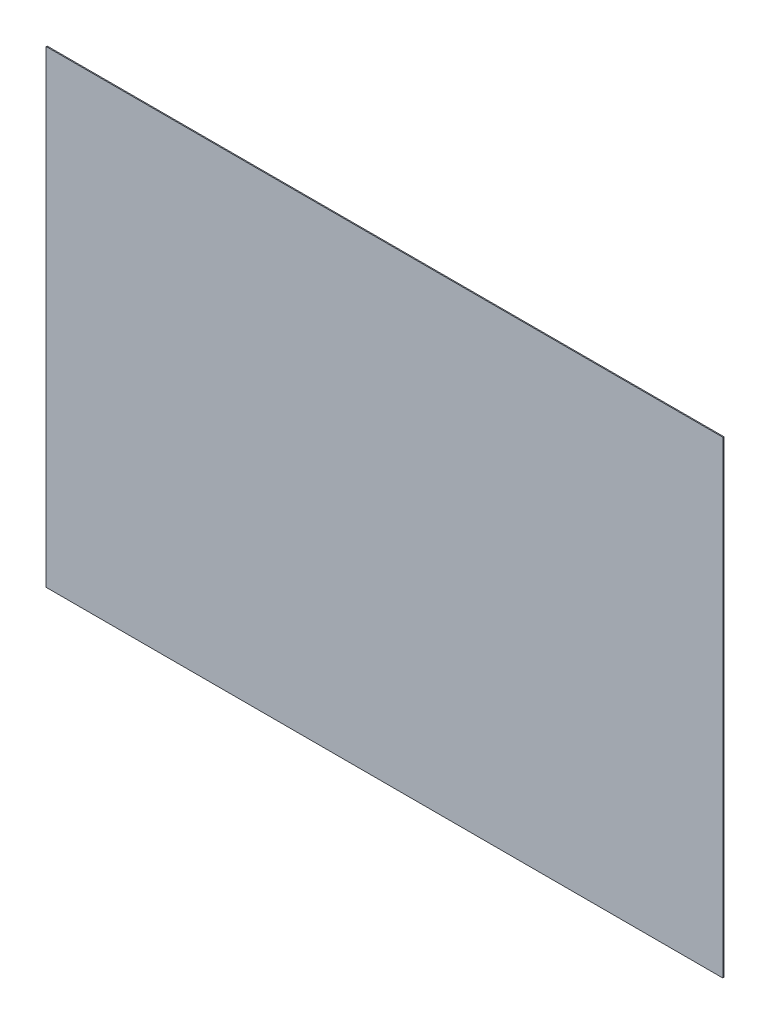
ISO-10303-21;
HEADER;
FILE_DESCRIPTION(('STEP AP214'),'2;1');
FILE_NAME('part.step','',(''),(''),'','','');
FILE_SCHEMA(('AUTOMOTIVE_DESIGN { 1 0 10303 214 1 1 1 1 }'));
ENDSEC;
DATA;
#1=APPLICATION_CONTEXT('core data for automotive mechanical design processes');
#2=APPLICATION_PROTOCOL_DEFINITION('international standard','automotive_design',2000,#1);
#3=PRODUCT_CONTEXT('',#1,'mechanical');
#4=PRODUCT('Part','Part','',(#3));
#5=PRODUCT_RELATED_PRODUCT_CATEGORY('part','',(#4));
#6=PRODUCT_DEFINITION_FORMATION('','',#4);
#7=PRODUCT_DEFINITION_CONTEXT('part definition',#1,'design');
#8=PRODUCT_DEFINITION('design','',#6,#7);
#9=PRODUCT_DEFINITION_SHAPE('','',#8);
#10=(LENGTH_UNIT() NAMED_UNIT(*) SI_UNIT(.MILLI.,.METRE.));
#11=(NAMED_UNIT(*) PLANE_ANGLE_UNIT() SI_UNIT($,.RADIAN.));
#12=(NAMED_UNIT(*) SI_UNIT($,.STERADIAN.) SOLID_ANGLE_UNIT());
#13=UNCERTAINTY_MEASURE_WITH_UNIT(LENGTH_MEASURE(1.E-05),#10,'distance_accuracy_value','');
#14=(GEOMETRIC_REPRESENTATION_CONTEXT(3) GLOBAL_UNCERTAINTY_ASSIGNED_CONTEXT((#13)) GLOBAL_UNIT_ASSIGNED_CONTEXT((#10,
#11,#12)) REPRESENTATION_CONTEXT('',''));
#15=CARTESIAN_POINT('',(0.,0.,0.));
#16=DIRECTION('',(0.,0.,1.));
#17=DIRECTION('',(1.,0.,0.));
#18=AXIS2_PLACEMENT_3D('',#15,#16,#17);
#19=CARTESIAN_POINT('',(650.,450.,1.92));
#20=DIRECTION('',(-1.,0.,0.));
#21=DIRECTION('',(0.,-1.,0.));
#22=AXIS2_PLACEMENT_3D('',#19,#20,#21);
#23=PLANE('',#22);
#24=DIRECTION('',(0.,1.,0.));
#25=VECTOR('',#24,1.);
#26=CARTESIAN_POINT('',(650.,450.,0.));
#27=LINE('',#26,#25);
#28=CARTESIAN_POINT('',(650.,-450.,0.));
#29=VERTEX_POINT('',#28);
#30=CARTESIAN_POINT('',(650.,450.,0.));
#31=VERTEX_POINT('',#30);
#32=EDGE_CURVE('E95',#29,#31,#27,.T.);
#33=ORIENTED_EDGE('',*,*,#32,.T.);
#34=DIRECTION('',(0.,0.,-1.));
#35=VECTOR('',#34,1.);
#36=CARTESIAN_POINT('',(650.,450.,1.92));
#37=LINE('',#36,#35);
#38=CARTESIAN_POINT('',(650.,450.,1.92));
#39=VERTEX_POINT('',#38);
#40=EDGE_CURVE('E11',#39,#31,#37,.T.);
#41=ORIENTED_EDGE('',*,*,#40,.F.);
#42=DIRECTION('',(0.,1.,0.));
#43=VECTOR('',#42,1.);
#44=CARTESIAN_POINT('',(650.,450.,1.92));
#45=LINE('',#44,#43);
#46=CARTESIAN_POINT('',(650.,-450.,1.92));
#47=VERTEX_POINT('',#46);
#48=EDGE_CURVE('E83',#47,#39,#45,.T.);
#49=ORIENTED_EDGE('',*,*,#48,.F.);
#50=DIRECTION('',(0.,0.,-1.));
#51=VECTOR('',#50,1.);
#52=CARTESIAN_POINT('',(650.,-450.,1.92));
#53=LINE('',#52,#51);
#54=EDGE_CURVE('E91',#47,#29,#53,.T.);
#55=ORIENTED_EDGE('',*,*,#54,.T.);
#56=EDGE_LOOP('',(#33,#41,#49,#55));
#57=FACE_BOUND('',#56,.T.);
#58=ADVANCED_FACE('F32',(#57),#23,.F.);
#59=CARTESIAN_POINT('',(-650.,450.,1.92));
#60=DIRECTION('',(0.,-1.,0.));
#61=DIRECTION('',(0.,0.,-1.));
#62=AXIS2_PLACEMENT_3D('',#59,#60,#61);
#63=PLANE('',#62);
#64=DIRECTION('',(-1.,0.,0.));
#65=VECTOR('',#64,1.);
#66=CARTESIAN_POINT('',(-650.,450.,0.));
#67=LINE('',#66,#65);
#68=CARTESIAN_POINT('',(-650.,450.,0.));
#69=VERTEX_POINT('',#68);
#70=EDGE_CURVE('E87',#31,#69,#67,.T.);
#71=ORIENTED_EDGE('',*,*,#70,.T.);
#72=DIRECTION('',(0.,0.,-1.));
#73=VECTOR('',#72,1.);
#74=CARTESIAN_POINT('',(-650.,450.,1.92));
#75=LINE('',#74,#73);
#76=CARTESIAN_POINT('',(-650.,450.,1.92));
#77=VERTEX_POINT('',#76);
#78=EDGE_CURVE('E40',#77,#69,#75,.T.);
#79=ORIENTED_EDGE('',*,*,#78,.F.);
#80=DIRECTION('',(-1.,0.,0.));
#81=VECTOR('',#80,1.);
#82=CARTESIAN_POINT('',(-650.,450.,1.92));
#83=LINE('',#82,#81);
#84=EDGE_CURVE('E78',#39,#77,#83,.T.);
#85=ORIENTED_EDGE('',*,*,#84,.F.);
#86=ORIENTED_EDGE('',*,*,#40,.T.);
#87=EDGE_LOOP('',(#71,#79,#85,#86));
#88=FACE_BOUND('',#87,.T.);
#89=ADVANCED_FACE('F86',(#88),#63,.F.);
#90=CARTESIAN_POINT('',(-650.,450.,1.92));
#91=DIRECTION('',(1.,0.,0.));
#92=DIRECTION('',(0.,1.,0.));
#93=AXIS2_PLACEMENT_3D('',#90,#91,#92);
#94=PLANE('',#93);
#95=DIRECTION('',(0.,-1.,0.));
#96=VECTOR('',#95,1.);
#97=CARTESIAN_POINT('',(-650.,450.,0.));
#98=LINE('',#97,#96);
#99=CARTESIAN_POINT('',(-650.,-450.,0.));
#100=VERTEX_POINT('',#99);
#101=EDGE_CURVE('E65',#69,#100,#98,.T.);
#102=ORIENTED_EDGE('',*,*,#101,.T.);
#103=DIRECTION('',(0.,0.,-1.));
#104=VECTOR('',#103,1.);
#105=CARTESIAN_POINT('',(-650.,-450.,1.92));
#106=LINE('',#105,#104);
#107=CARTESIAN_POINT('',(-650.,-450.,1.92));
#108=VERTEX_POINT('',#107);
#109=EDGE_CURVE('E88',#108,#100,#106,.T.);
#110=ORIENTED_EDGE('',*,*,#109,.F.);
#111=DIRECTION('',(0.,-1.,0.));
#112=VECTOR('',#111,1.);
#113=CARTESIAN_POINT('',(-650.,450.,1.92));
#114=LINE('',#113,#112);
#115=EDGE_CURVE('E81',#77,#108,#114,.T.);
#116=ORIENTED_EDGE('',*,*,#115,.F.);
#117=ORIENTED_EDGE('',*,*,#78,.T.);
#118=EDGE_LOOP('',(#102,#110,#116,#117));
#119=FACE_BOUND('',#118,.T.);
#120=ADVANCED_FACE('F89',(#119),#94,.F.);
#121=CARTESIAN_POINT('',(-650.,-450.,1.92));
#122=DIRECTION('',(0.,1.,0.));
#123=DIRECTION('',(0.,0.,1.));
#124=AXIS2_PLACEMENT_3D('',#121,#122,#123);
#125=PLANE('',#124);
#126=DIRECTION('',(1.,0.,0.));
#127=VECTOR('',#126,1.);
#128=CARTESIAN_POINT('',(-650.,-450.,0.));
#129=LINE('',#128,#127);
#130=EDGE_CURVE('E71',#100,#29,#129,.T.);
#131=ORIENTED_EDGE('',*,*,#130,.T.);
#132=ORIENTED_EDGE('',*,*,#54,.F.);
#133=DIRECTION('',(1.,0.,0.));
#134=VECTOR('',#133,1.);
#135=CARTESIAN_POINT('',(-650.,-450.,1.92));
#136=LINE('',#135,#134);
#137=EDGE_CURVE('E48',#108,#47,#136,.T.);
#138=ORIENTED_EDGE('',*,*,#137,.F.);
#139=ORIENTED_EDGE('',*,*,#109,.T.);
#140=EDGE_LOOP('',(#131,#132,#138,#139));
#141=FACE_BOUND('',#140,.T.);
#142=ADVANCED_FACE('F102',(#141),#125,.F.);
#143=CARTESIAN_POINT('',(0.,0.,1.92));
#144=DIRECTION('',(0.,0.,1.));
#145=DIRECTION('',(1.,0.,0.));
#146=AXIS2_PLACEMENT_3D('',#143,#144,#145);
#147=PLANE('',#146);
#148=ORIENTED_EDGE('',*,*,#48,.T.);
#149=ORIENTED_EDGE('',*,*,#84,.T.);
#150=ORIENTED_EDGE('',*,*,#115,.T.);
#151=ORIENTED_EDGE('',*,*,#137,.T.);
#152=EDGE_LOOP('',(#148,#149,#150,#151));
#153=FACE_BOUND('',#152,.T.);
#154=ADVANCED_FACE('F79',(#153),#147,.T.);
#155=CARTESIAN_POINT('',(0.,0.,0.));
#156=DIRECTION('',(0.,0.,1.));
#157=DIRECTION('',(1.,0.,0.));
#158=AXIS2_PLACEMENT_3D('',#155,#156,#157);
#159=PLANE('',#158);
#160=ORIENTED_EDGE('',*,*,#32,.F.);
#161=ORIENTED_EDGE('',*,*,#130,.F.);
#162=ORIENTED_EDGE('',*,*,#101,.F.);
#163=ORIENTED_EDGE('',*,*,#70,.F.);
#164=EDGE_LOOP('',(#160,#161,#162,#163));
#165=FACE_BOUND('',#164,.T.);
#166=ADVANCED_FACE('F105',(#165),#159,.F.);
#167=CLOSED_SHELL('',(#58,#89,#120,#142,#154,#166));
#168=MANIFOLD_SOLID_BREP('B2',#167);
#169=ADVANCED_BREP_SHAPE_REPRESENTATION('',(#18,#168),#14);
#170=SHAPE_DEFINITION_REPRESENTATION(#9,#169);
ENDSEC;
END-ISO-10303-21;
